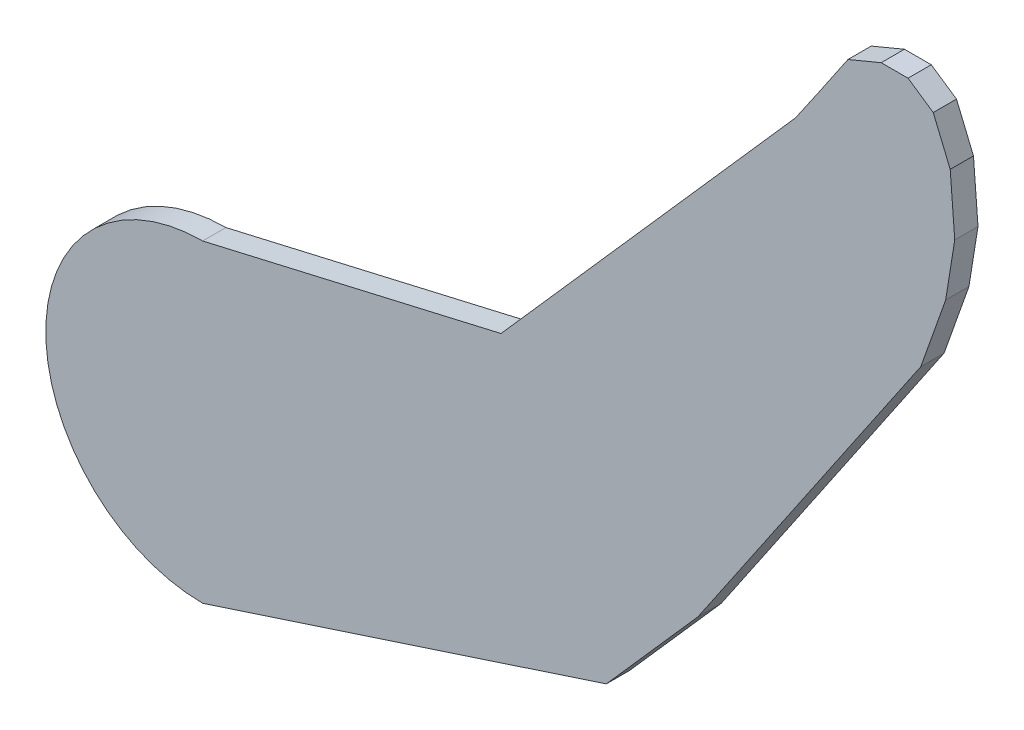
ISO-10303-21;
HEADER;
FILE_DESCRIPTION(('STEP AP214'),'2;1');
FILE_NAME('part.step','',(''),(''),'','','');
FILE_SCHEMA(('AUTOMOTIVE_DESIGN { 1 0 10303 214 1 1 1 1 }'));
ENDSEC;
DATA;
#1=APPLICATION_CONTEXT('core data for automotive mechanical design processes');
#2=APPLICATION_PROTOCOL_DEFINITION('international standard','automotive_design',2000,#1);
#3=PRODUCT_CONTEXT('',#1,'mechanical');
#4=PRODUCT('Part','Part','',(#3));
#5=PRODUCT_RELATED_PRODUCT_CATEGORY('part','',(#4));
#6=PRODUCT_DEFINITION_FORMATION('','',#4);
#7=PRODUCT_DEFINITION_CONTEXT('part definition',#1,'design');
#8=PRODUCT_DEFINITION('design','',#6,#7);
#9=PRODUCT_DEFINITION_SHAPE('','',#8);
#10=(LENGTH_UNIT() NAMED_UNIT(*) SI_UNIT(.MILLI.,.METRE.));
#11=(NAMED_UNIT(*) PLANE_ANGLE_UNIT() SI_UNIT($,.RADIAN.));
#12=(NAMED_UNIT(*) SI_UNIT($,.STERADIAN.) SOLID_ANGLE_UNIT());
#13=UNCERTAINTY_MEASURE_WITH_UNIT(LENGTH_MEASURE(1.E-05),#10,'distance_accuracy_value','');
#14=(GEOMETRIC_REPRESENTATION_CONTEXT(3) GLOBAL_UNCERTAINTY_ASSIGNED_CONTEXT((#13)) GLOBAL_UNIT_ASSIGNED_CONTEXT((#10,
#11,#12)) REPRESENTATION_CONTEXT('',''));
#15=CARTESIAN_POINT('',(0.,0.,0.));
#16=DIRECTION('',(0.,0.,1.));
#17=DIRECTION('',(1.,0.,0.));
#18=AXIS2_PLACEMENT_3D('',#15,#16,#17);
#19=CARTESIAN_POINT('',(-27.9736623903052,120.901896215262,20.));
#20=DIRECTION('',(0.225419700936087,-0.974261750470522,0.));
#21=DIRECTION('',(0.974261750470522,0.225419700936087,0.));
#22=AXIS2_PLACEMENT_3D('',#19,#20,#21);
#23=PLANE('',#22);
#24=DIRECTION('',(-0.974261750470522,-0.225419700936087,0.));
#25=VECTOR('',#24,1.);
#26=CARTESIAN_POINT('',(-27.9736623903052,120.901896215262,0.));
#27=LINE('',#26,#25);
#28=CARTESIAN_POINT('',(762.554169483522,303.810182778487,0.));
#29=VERTEX_POINT('',#28);
#30=CARTESIAN_POINT('',(506.078323886515,244.468113376824,0.));
#31=VERTEX_POINT('',#30);
#32=EDGE_CURVE('E182',#29,#31,#27,.T.);
#33=ORIENTED_EDGE('',*,*,#32,.T.);
#34=DIRECTION('',(0.,0.,-1.));
#35=VECTOR('',#34,1.);
#36=CARTESIAN_POINT('',(506.078323886515,244.468113376824,20.));
#37=LINE('',#36,#35);
#38=CARTESIAN_POINT('',(506.078323886515,244.468113376824,20.));
#39=VERTEX_POINT('',#38);
#40=EDGE_CURVE('E11',#39,#31,#37,.T.);
#41=ORIENTED_EDGE('',*,*,#40,.F.);
#42=DIRECTION('',(-0.974261750470522,-0.225419700936087,0.));
#43=VECTOR('',#42,1.);
#44=CARTESIAN_POINT('',(-27.9736623903052,120.901896215262,20.));
#45=LINE('',#44,#43);
#46=CARTESIAN_POINT('',(762.554169483522,303.810182778487,20.));
#47=VERTEX_POINT('',#46);
#48=EDGE_CURVE('E213',#47,#39,#45,.T.);
#49=ORIENTED_EDGE('',*,*,#48,.F.);
#50=DIRECTION('',(0.,0.,-1.));
#51=VECTOR('',#50,1.);
#52=CARTESIAN_POINT('',(762.554169483522,303.810182778487,20.));
#53=LINE('',#52,#51);
#54=EDGE_CURVE('E178',#47,#29,#53,.T.);
#55=ORIENTED_EDGE('',*,*,#54,.T.);
#56=EDGE_LOOP('',(#33,#41,#49,#55));
#57=FACE_BOUND('',#56,.T.);
#58=ADVANCED_FACE('F45',(#57),#23,.F.);
#59=CARTESIAN_POINT('',(506.07832388652,109.612625576141,20.));
#60=DIRECTION('',(0.,0.,-1.));
#61=DIRECTION('',(-1.,0.,0.));
#62=AXIS2_PLACEMENT_3D('',#59,#60,#61);
#63=CYLINDRICAL_SURFACE('',#62,134.85548780068);
#64=CARTESIAN_POINT('',(506.07832388652,109.612625576141,0.));
#65=DIRECTION('',(0.,0.,1.));
#66=DIRECTION('',(1.,0.,0.));
#67=AXIS2_PLACEMENT_3D('',#64,#65,#66);
#68=CIRCLE('',#67,134.85548780068);
#69=CARTESIAN_POINT('',(506.078323886515,-25.2428622245363,0.));
#70=VERTEX_POINT('',#69);
#71=EDGE_CURVE('E185',#31,#70,#68,.T.);
#72=ORIENTED_EDGE('',*,*,#71,.T.);
#73=DIRECTION('',(0.,0.,-1.));
#74=VECTOR('',#73,1.);
#75=CARTESIAN_POINT('',(506.078323886515,-25.2428622245363,20.));
#76=LINE('',#75,#74);
#77=CARTESIAN_POINT('',(506.078323886515,-25.2428622245363,20.));
#78=VERTEX_POINT('',#77);
#79=EDGE_CURVE('E53',#78,#70,#76,.T.);
#80=ORIENTED_EDGE('',*,*,#79,.F.);
#81=CARTESIAN_POINT('',(506.07832388652,109.612625576141,20.));
#82=DIRECTION('',(0.,0.,1.));
#83=DIRECTION('',(1.,0.,0.));
#84=AXIS2_PLACEMENT_3D('',#81,#82,#83);
#85=CIRCLE('',#84,134.85548780068);
#86=EDGE_CURVE('E121',#39,#78,#85,.T.);
#87=ORIENTED_EDGE('',*,*,#86,.F.);
#88=ORIENTED_EDGE('',*,*,#40,.T.);
#89=EDGE_LOOP('',(#72,#80,#87,#88));
#90=FACE_BOUND('',#89,.T.);
#91=ADVANCED_FACE('F248',(#90),#63,.T.);
#92=CARTESIAN_POINT('',(56.2990000385816,-172.25045946861,20.));
#93=DIRECTION('',(0.310670803985646,-0.950517570353601,0.));
#94=DIRECTION('',(0.950517570353601,0.310670803985646,0.));
#95=AXIS2_PLACEMENT_3D('',#92,#93,#94);
#96=PLANE('',#95);
#97=DIRECTION('',(-0.950517570353601,-0.310670803985646,0.));
#98=VECTOR('',#97,1.);
#99=CARTESIAN_POINT('',(56.2990000385816,-172.25045946861,0.));
#100=LINE('',#99,#98);
#101=CARTESIAN_POINT('',(853.07011629034,88.1692644786177,0.));
#102=VERTEX_POINT('',#101);
#103=EDGE_CURVE('E188',#102,#70,#100,.T.);
#104=ORIENTED_EDGE('',*,*,#103,.F.);
#105=DIRECTION('',(0.,0.,-1.));
#106=VECTOR('',#105,1.);
#107=CARTESIAN_POINT('',(853.07011629034,88.1692644786177,20.));
#108=LINE('',#107,#106);
#109=CARTESIAN_POINT('',(853.07011629034,88.1692644786177,20.));
#110=VERTEX_POINT('',#109);
#111=EDGE_CURVE('E241',#110,#102,#108,.T.);
#112=ORIENTED_EDGE('',*,*,#111,.F.);
#113=DIRECTION('',(-0.950517570353601,-0.310670803985646,0.));
#114=VECTOR('',#113,1.);
#115=CARTESIAN_POINT('',(56.2990000385816,-172.25045946861,20.));
#116=LINE('',#115,#114);
#117=EDGE_CURVE('E247',#110,#78,#116,.T.);
#118=ORIENTED_EDGE('',*,*,#117,.T.);
#119=ORIENTED_EDGE('',*,*,#79,.T.);
#120=EDGE_LOOP('',(#104,#112,#118,#119));
#121=FACE_BOUND('',#120,.T.);
#122=ADVANCED_FACE('F245',(#121),#96,.T.);
#123=CARTESIAN_POINT('',(436.202479970037,-384.613573474033,20.));
#124=DIRECTION('',(-0.750068966901177,0.661359618431456,0.));
#125=DIRECTION('',(-0.661359618431456,-0.750068966901177,0.));
#126=AXIS2_PLACEMENT_3D('',#123,#124,#125);
#127=PLANE('',#126);
#128=DIRECTION('',(0.661359618431456,0.750068966901177,0.));
#129=VECTOR('',#128,1.);
#130=CARTESIAN_POINT('',(436.202479970037,-384.613573474033,0.));
#131=LINE('',#130,#129);
#132=CARTESIAN_POINT('',(931.851074637414,177.517253669462,0.));
#133=VERTEX_POINT('',#132);
#134=EDGE_CURVE('E191',#102,#133,#131,.T.);
#135=ORIENTED_EDGE('',*,*,#134,.T.);
#136=DIRECTION('',(0.,0.,-1.));
#137=VECTOR('',#136,1.);
#138=CARTESIAN_POINT('',(931.851074637414,177.517253669462,20.));
#139=LINE('',#138,#137);
#140=CARTESIAN_POINT('',(931.851074637414,177.517253669462,20.));
#141=VERTEX_POINT('',#140);
#142=EDGE_CURVE('E238',#141,#133,#139,.T.);
#143=ORIENTED_EDGE('',*,*,#142,.F.);
#144=DIRECTION('',(0.661359618431456,0.750068966901177,0.));
#145=VECTOR('',#144,1.);
#146=CARTESIAN_POINT('',(436.202479970037,-384.613573474033,20.));
#147=LINE('',#146,#145);
#148=EDGE_CURVE('E267',#110,#141,#147,.T.);
#149=ORIENTED_EDGE('',*,*,#148,.F.);
#150=ORIENTED_EDGE('',*,*,#111,.T.);
#151=EDGE_LOOP('',(#135,#143,#149,#150));
#152=FACE_BOUND('',#151,.T.);
#153=ADVANCED_FACE('F258',(#152),#127,.F.);
#154=CARTESIAN_POINT('',(555.155457153364,-377.076882298712,20.));
#155=DIRECTION('',(-0.827223508552381,0.561872998904814,0.));
#156=DIRECTION('',(-0.561872998904814,-0.827223508552381,0.));
#157=AXIS2_PLACEMENT_3D('',#154,#155,#156);
#158=PLANE('',#157);
#159=DIRECTION('',(0.561872998904814,0.827223508552381,0.));
#160=VECTOR('',#159,1.);
#161=CARTESIAN_POINT('',(555.155457153364,-377.076882298712,0.));
#162=LINE('',#161,#160);
#163=CARTESIAN_POINT('',(1123.4323073276,459.574764508514,0.));
#164=VERTEX_POINT('',#163);
#165=EDGE_CURVE('E193',#133,#164,#162,.T.);
#166=ORIENTED_EDGE('',*,*,#165,.T.);
#167=DIRECTION('',(0.,0.,-1.));
#168=VECTOR('',#167,1.);
#169=CARTESIAN_POINT('',(1123.4323073276,459.574764508514,20.));
#170=LINE('',#169,#168);
#171=CARTESIAN_POINT('',(1123.4323073276,459.574764508514,20.));
#172=VERTEX_POINT('',#171);
#173=EDGE_CURVE('E235',#172,#164,#170,.T.);
#174=ORIENTED_EDGE('',*,*,#173,.F.);
#175=DIRECTION('',(0.561872998904814,0.827223508552381,0.));
#176=VECTOR('',#175,1.);
#177=CARTESIAN_POINT('',(555.155457153364,-377.076882298712,20.));
#178=LINE('',#177,#176);
#179=EDGE_CURVE('E264',#141,#172,#178,.T.);
#180=ORIENTED_EDGE('',*,*,#179,.F.);
#181=ORIENTED_EDGE('',*,*,#142,.T.);
#182=EDGE_LOOP('',(#166,#174,#180,#181));
#183=FACE_BOUND('',#182,.T.);
#184=ADVANCED_FACE('F262',(#183),#158,.F.);
#185=CARTESIAN_POINT('',(852.960677119872,-302.663466075392,20.));
#186=DIRECTION('',(-0.942427745481038,0.334409845171353,0.));
#187=DIRECTION('',(-0.334409845171353,-0.942427745481038,0.));
#188=AXIS2_PLACEMENT_3D('',#185,#186,#187);
#189=PLANE('',#188);
#190=DIRECTION('',(0.334409845171353,0.942427745481038,0.));
#191=VECTOR('',#190,1.);
#192=CARTESIAN_POINT('',(852.960677119872,-302.663466075392,0.));
#193=LINE('',#192,#191);
#194=CARTESIAN_POINT('',(1144.83410558076,519.888923221853,0.));
#195=VERTEX_POINT('',#194);
#196=EDGE_CURVE('E195',#164,#195,#193,.T.);
#197=ORIENTED_EDGE('',*,*,#196,.T.);
#198=DIRECTION('',(0.,0.,-1.));
#199=VECTOR('',#198,1.);
#200=CARTESIAN_POINT('',(1144.83410558076,519.888923221853,20.));
#201=LINE('',#200,#199);
#202=CARTESIAN_POINT('',(1144.83410558076,519.888923221853,20.));
#203=VERTEX_POINT('',#202);
#204=EDGE_CURVE('E232',#203,#195,#201,.T.);
#205=ORIENTED_EDGE('',*,*,#204,.F.);
#206=DIRECTION('',(0.334409845171353,0.942427745481038,0.));
#207=VECTOR('',#206,1.);
#208=CARTESIAN_POINT('',(852.960677119872,-302.663466075392,20.));
#209=LINE('',#208,#207);
#210=EDGE_CURVE('E266',#172,#203,#209,.T.);
#211=ORIENTED_EDGE('',*,*,#210,.F.);
#212=ORIENTED_EDGE('',*,*,#173,.T.);
#213=EDGE_LOOP('',(#197,#205,#211,#212));
#214=FACE_BOUND('',#213,.T.);
#215=ADVANCED_FACE('F317',(#214),#189,.F.);
#216=CARTESIAN_POINT('',(1035.15198699759,-165.62431792027,20.));
#217=DIRECTION('',(-0.987440631916608,0.157990501107283,0.));
#218=DIRECTION('',(-0.157990501107283,-0.987440631916608,0.));
#219=AXIS2_PLACEMENT_3D('',#216,#217,#218);
#220=PLANE('',#219);
#221=DIRECTION('',(0.157990501107283,0.987440631916608,0.));
#222=VECTOR('',#221,1.);
#223=CARTESIAN_POINT('',(1035.15198699759,-165.62431792027,0.));
#224=LINE('',#223,#222);
#225=CARTESIAN_POINT('',(1152.61657767284,568.529373797133,0.));
#226=VERTEX_POINT('',#225);
#227=EDGE_CURVE('E197',#195,#226,#224,.T.);
#228=ORIENTED_EDGE('',*,*,#227,.T.);
#229=DIRECTION('',(0.,0.,-1.));
#230=VECTOR('',#229,1.);
#231=CARTESIAN_POINT('',(1152.61657767284,568.529373797133,20.));
#232=LINE('',#231,#230);
#233=CARTESIAN_POINT('',(1152.61657767284,568.529373797133,20.));
#234=VERTEX_POINT('',#233);
#235=EDGE_CURVE('E229',#234,#226,#232,.T.);
#236=ORIENTED_EDGE('',*,*,#235,.F.);
#237=DIRECTION('',(0.157990501107283,0.987440631916608,0.));
#238=VECTOR('',#237,1.);
#239=CARTESIAN_POINT('',(1035.15198699759,-165.62431792027,20.));
#240=LINE('',#239,#238);
#241=EDGE_CURVE('E269',#203,#234,#240,.T.);
#242=ORIENTED_EDGE('',*,*,#241,.F.);
#243=ORIENTED_EDGE('',*,*,#204,.T.);
#244=EDGE_LOOP('',(#228,#236,#242,#243));
#245=FACE_BOUND('',#244,.T.);
#246=ADVANCED_FACE('F320',(#245),#220,.F.);
#247=CARTESIAN_POINT('',(1189.31225580014,91.4855581375762,20.));
#248=DIRECTION('',(-0.997054485501639,-0.0766964988839904,0.));
#249=DIRECTION('',(0.0766964988839904,-0.997054485501639,0.));
#250=AXIS2_PLACEMENT_3D('',#247,#248,#249);
#251=PLANE('',#250);
#252=DIRECTION('',(-0.0766964988839904,0.997054485501639,0.));
#253=VECTOR('',#252,1.);
#254=CARTESIAN_POINT('',(1189.31225580014,91.4855581375762,0.));
#255=LINE('',#254,#253);
#256=CARTESIAN_POINT('',(1148.72534162685,619.115442395432,0.));
#257=VERTEX_POINT('',#256);
#258=EDGE_CURVE('E199',#226,#257,#255,.T.);
#259=ORIENTED_EDGE('',*,*,#258,.T.);
#260=DIRECTION('',(0.,0.,-1.));
#261=VECTOR('',#260,1.);
#262=CARTESIAN_POINT('',(1148.72534162685,619.115442395432,20.));
#263=LINE('',#262,#261);
#264=CARTESIAN_POINT('',(1148.72534162685,619.115442395432,20.));
#265=VERTEX_POINT('',#264);
#266=EDGE_CURVE('E226',#265,#257,#263,.T.);
#267=ORIENTED_EDGE('',*,*,#266,.F.);
#268=DIRECTION('',(-0.0766964988839904,0.997054485501639,0.));
#269=VECTOR('',#268,1.);
#270=CARTESIAN_POINT('',(1189.31225580014,91.4855581375762,20.));
#271=LINE('',#270,#269);
#272=EDGE_CURVE('E275',#234,#265,#271,.T.);
#273=ORIENTED_EDGE('',*,*,#272,.F.);
#274=ORIENTED_EDGE('',*,*,#235,.T.);
#275=EDGE_LOOP('',(#259,#267,#273,#274));
#276=FACE_BOUND('',#275,.T.);
#277=ADVANCED_FACE('F324',(#276),#251,.F.);
#278=CARTESIAN_POINT('',(1198.59985643768,499.416606849591,20.));
#279=DIRECTION('',(-0.92307692307677,-0.384615384615752,0.));
#280=DIRECTION('',(0.384615384615752,-0.92307692307677,0.));
#281=AXIS2_PLACEMENT_3D('',#278,#279,#280);
#282=PLANE('',#281);
#283=DIRECTION('',(-0.384615384615752,0.92307692307677,0.));
#284=VECTOR('',#283,1.);
#285=CARTESIAN_POINT('',(1198.59985643768,499.416606849591,0.));
#286=LINE('',#285,#284);
#287=CARTESIAN_POINT('',(1134.13320645425,654.13656680963,0.));
#288=VERTEX_POINT('',#287);
#289=EDGE_CURVE('E201',#257,#288,#286,.T.);
#290=ORIENTED_EDGE('',*,*,#289,.T.);
#291=DIRECTION('',(0.,0.,-1.));
#292=VECTOR('',#291,1.);
#293=CARTESIAN_POINT('',(1134.13320645425,654.13656680963,20.));
#294=LINE('',#293,#292);
#295=CARTESIAN_POINT('',(1134.13320645425,654.13656680963,20.));
#296=VERTEX_POINT('',#295);
#297=EDGE_CURVE('E223',#296,#288,#294,.T.);
#298=ORIENTED_EDGE('',*,*,#297,.F.);
#299=DIRECTION('',(-0.384615384615752,0.92307692307677,0.));
#300=VECTOR('',#299,1.);
#301=CARTESIAN_POINT('',(1198.59985643768,499.416606849591,20.));
#302=LINE('',#301,#300);
#303=EDGE_CURVE('E277',#265,#296,#302,.T.);
#304=ORIENTED_EDGE('',*,*,#303,.F.);
#305=ORIENTED_EDGE('',*,*,#266,.T.);
#306=EDGE_LOOP('',(#290,#298,#304,#305));
#307=FACE_BOUND('',#306,.T.);
#308=ADVANCED_FACE('F328',(#307),#282,.F.);
#309=CARTESIAN_POINT('',(662.086403617073,974.763761263646,20.));
#310=DIRECTION('',(-0.561872998904815,-0.82722350855238,0.));
#311=DIRECTION('',(0.82722350855238,-0.561872998904815,0.));
#312=AXIS2_PLACEMENT_3D('',#309,#310,#311);
#313=PLANE('',#312);
#314=DIRECTION('',(-0.82722350855238,0.561872998904815,0.));
#315=VECTOR('',#314,1.);
#316=CARTESIAN_POINT('',(662.086403617073,974.763761263646,0.));
#317=LINE('',#316,#315);
#318=CARTESIAN_POINT('',(1112.46701738498,668.852839378448,0.));
#319=VERTEX_POINT('',#318);
#320=EDGE_CURVE('E203',#288,#319,#317,.T.);
#321=ORIENTED_EDGE('',*,*,#320,.T.);
#322=DIRECTION('',(0.,0.,-1.));
#323=VECTOR('',#322,1.);
#324=CARTESIAN_POINT('',(1112.46701738498,668.852839378448,20.));
#325=LINE('',#324,#323);
#326=CARTESIAN_POINT('',(1112.46701738498,668.852839378448,20.));
#327=VERTEX_POINT('',#326);
#328=EDGE_CURVE('E220',#327,#319,#325,.T.);
#329=ORIENTED_EDGE('',*,*,#328,.F.);
#330=DIRECTION('',(-0.82722350855238,0.561872998904815,0.));
#331=VECTOR('',#330,1.);
#332=CARTESIAN_POINT('',(662.086403617073,974.763761263646,20.));
#333=LINE('',#332,#331);
#334=EDGE_CURVE('E279',#296,#327,#333,.T.);
#335=ORIENTED_EDGE('',*,*,#334,.F.);
#336=ORIENTED_EDGE('',*,*,#297,.T.);
#337=EDGE_LOOP('',(#321,#329,#335,#336));
#338=FACE_BOUND('',#337,.T.);
#339=ADVANCED_FACE('F332',(#338),#313,.F.);
#340=CARTESIAN_POINT('',(0.,668.852839378448,20.));
#341=DIRECTION('',(0.,-1.,0.));
#342=DIRECTION('',(0.,0.,-1.));
#343=AXIS2_PLACEMENT_3D('',#340,#341,#342);
#344=PLANE('',#343);
#345=DIRECTION('',(-1.,0.,0.));
#346=VECTOR('',#345,1.);
#347=CARTESIAN_POINT('',(0.,668.852839378448,0.));
#348=LINE('',#347,#346);
#349=CARTESIAN_POINT('',(1089.38399192499,668.852839378448,0.));
#350=VERTEX_POINT('',#349);
#351=EDGE_CURVE('E205',#319,#350,#348,.T.);
#352=ORIENTED_EDGE('',*,*,#351,.T.);
#353=DIRECTION('',(0.,0.,-1.));
#354=VECTOR('',#353,1.);
#355=CARTESIAN_POINT('',(1089.38399192499,668.852839378448,20.));
#356=LINE('',#355,#354);
#357=CARTESIAN_POINT('',(1089.38399192499,668.852839378448,20.));
#358=VERTEX_POINT('',#357);
#359=EDGE_CURVE('E217',#358,#350,#356,.T.);
#360=ORIENTED_EDGE('',*,*,#359,.F.);
#361=DIRECTION('',(-1.,0.,0.));
#362=VECTOR('',#361,1.);
#363=CARTESIAN_POINT('',(0.,668.852839378448,20.));
#364=LINE('',#363,#362);
#365=EDGE_CURVE('E281',#327,#358,#364,.T.);
#366=ORIENTED_EDGE('',*,*,#365,.F.);
#367=ORIENTED_EDGE('',*,*,#328,.T.);
#368=EDGE_LOOP('',(#352,#360,#366,#367));
#369=FACE_BOUND('',#368,.T.);
#370=ADVANCED_FACE('F287',(#369),#344,.F.);
#371=CARTESIAN_POINT('',(-76.3110684293617,183.146564230267,20.));
#372=DIRECTION('',(0.384615384615744,-0.923076923076773,0.));
#373=DIRECTION('',(0.923076923076773,0.384615384615744,0.));
#374=AXIS2_PLACEMENT_3D('',#371,#372,#373);
#375=PLANE('',#374);
#376=DIRECTION('',(-0.923076923076773,-0.384615384615744,0.));
#377=VECTOR('',#376,1.);
#378=CARTESIAN_POINT('',(-76.3110684293617,183.146564230267,0.));
#379=LINE('',#378,#377);
#380=CARTESIAN_POINT('',(1060.81186349425,656.947785865625,0.));
#381=VERTEX_POINT('',#380);
#382=EDGE_CURVE('E207',#350,#381,#379,.T.);
#383=ORIENTED_EDGE('',*,*,#382,.T.);
#384=DIRECTION('',(0.,0.,-1.));
#385=VECTOR('',#384,1.);
#386=CARTESIAN_POINT('',(1060.81186349425,656.947785865625,20.));
#387=LINE('',#386,#385);
#388=CARTESIAN_POINT('',(1060.81186349425,656.947785865625,20.));
#389=VERTEX_POINT('',#388);
#390=EDGE_CURVE('E174',#389,#381,#387,.T.);
#391=ORIENTED_EDGE('',*,*,#390,.F.);
#392=DIRECTION('',(-0.923076923076773,-0.384615384615744,0.));
#393=VECTOR('',#392,1.);
#394=CARTESIAN_POINT('',(-76.3110684293617,183.146564230267,20.));
#395=LINE('',#394,#393);
#396=EDGE_CURVE('E161',#358,#389,#395,.T.);
#397=ORIENTED_EDGE('',*,*,#396,.F.);
#398=ORIENTED_EDGE('',*,*,#359,.T.);
#399=EDGE_LOOP('',(#383,#391,#397,#398));
#400=FACE_BOUND('',#399,.T.);
#401=ADVANCED_FACE('F291',(#400),#375,.F.);
#402=CARTESIAN_POINT('',(420.566461434368,-285.660328172302,20.));
#403=DIRECTION('',(0.827223508552378,-0.561872998904818,0.));
#404=DIRECTION('',(0.561872998904818,0.827223508552378,0.));
#405=AXIS2_PLACEMENT_3D('',#402,#403,#404);
#406=PLANE('',#405);
#407=DIRECTION('',(-0.561872998904818,-0.827223508552378,0.));
#408=VECTOR('',#407,1.);
#409=CARTESIAN_POINT('',(420.566461434368,-285.660328172302,0.));
#410=LINE('',#409,#408);
#411=CARTESIAN_POINT('',(1035.11509344185,619.115442395408,0.));
#412=VERTEX_POINT('',#411);
#413=EDGE_CURVE('E170',#381,#412,#410,.T.);
#414=ORIENTED_EDGE('',*,*,#413,.T.);
#415=DIRECTION('',(0.,0.,-1.));
#416=VECTOR('',#415,1.);
#417=CARTESIAN_POINT('',(1035.11509344185,619.115442395408,20.));
#418=LINE('',#417,#416);
#419=CARTESIAN_POINT('',(1035.11509344185,619.115442395408,20.));
#420=VERTEX_POINT('',#419);
#421=EDGE_CURVE('E167',#420,#412,#418,.T.);
#422=ORIENTED_EDGE('',*,*,#421,.F.);
#423=DIRECTION('',(-0.561872998904818,-0.827223508552378,0.));
#424=VECTOR('',#423,1.);
#425=CARTESIAN_POINT('',(420.566461434368,-285.660328172302,20.));
#426=LINE('',#425,#424);
#427=EDGE_CURVE('E155',#389,#420,#426,.T.);
#428=ORIENTED_EDGE('',*,*,#427,.F.);
#429=ORIENTED_EDGE('',*,*,#390,.T.);
#430=EDGE_LOOP('',(#414,#422,#428,#429));
#431=FACE_BOUND('',#430,.T.);
#432=ADVANCED_FACE('F168',(#431),#406,.F.);
#433=CARTESIAN_POINT('',(413.592664591776,-284.481924116286,20.));
#434=DIRECTION('',(-0.823914524539985,0.566714086865724,0.));
#435=DIRECTION('',(-0.566714086865724,-0.823914524539985,0.));
#436=AXIS2_PLACEMENT_3D('',#433,#434,#435);
#437=PLANE('',#436);
#438=DIRECTION('',(0.566714086865724,0.823914524539985,0.));
#439=VECTOR('',#438,1.);
#440=CARTESIAN_POINT('',(413.592664591776,-284.481924116286,0.));
#441=LINE('',#440,#439);
#442=CARTESIAN_POINT('',(1015.76885313443,590.989004824954,0.));
#443=VERTEX_POINT('',#442);
#444=EDGE_CURVE('E210',#443,#412,#441,.T.);
#445=ORIENTED_EDGE('',*,*,#444,.F.);
#446=DIRECTION('',(0.,0.,-1.));
#447=VECTOR('',#446,1.);
#448=CARTESIAN_POINT('',(1015.76885313443,590.989004824954,20.));
#449=LINE('',#448,#447);
#450=CARTESIAN_POINT('',(1015.76885313443,590.989004824954,20.));
#451=VERTEX_POINT('',#450);
#452=EDGE_CURVE('E110',#451,#443,#449,.T.);
#453=ORIENTED_EDGE('',*,*,#452,.F.);
#454=DIRECTION('',(0.566714086865724,0.823914524539985,0.));
#455=VECTOR('',#454,1.);
#456=CARTESIAN_POINT('',(413.592664591776,-284.481924116286,20.));
#457=LINE('',#456,#455);
#458=EDGE_CURVE('E159',#451,#420,#457,.T.);
#459=ORIENTED_EDGE('',*,*,#458,.T.);
#460=ORIENTED_EDGE('',*,*,#421,.T.);
#461=EDGE_LOOP('',(#445,#453,#459,#460));
#462=FACE_BOUND('',#461,.T.);
#463=ADVANCED_FACE('F176',(#462),#437,.T.);
#464=CARTESIAN_POINT('',(278.305913173315,-245.391158234349,20.));
#465=DIRECTION('',(0.750068966901177,-0.661359618431456,0.));
#466=DIRECTION('',(0.661359618431456,0.750068966901177,0.));
#467=AXIS2_PLACEMENT_3D('',#464,#465,#466);
#468=PLANE('',#467);
#469=DIRECTION('',(-0.661359618431456,-0.750068966901177,0.));
#470=VECTOR('',#469,1.);
#471=CARTESIAN_POINT('',(278.305913173315,-245.391158234349,0.));
#472=LINE('',#471,#470);
#473=EDGE_CURVE('E113',#443,#29,#472,.T.);
#474=ORIENTED_EDGE('',*,*,#473,.T.);
#475=ORIENTED_EDGE('',*,*,#54,.F.);
#476=DIRECTION('',(-0.661359618431456,-0.750068966901177,0.));
#477=VECTOR('',#476,1.);
#478=CARTESIAN_POINT('',(278.305913173315,-245.391158234349,20.));
#479=LINE('',#478,#477);
#480=EDGE_CURVE('E61',#451,#47,#479,.T.);
#481=ORIENTED_EDGE('',*,*,#480,.F.);
#482=ORIENTED_EDGE('',*,*,#452,.T.);
#483=EDGE_LOOP('',(#474,#475,#481,#482));
#484=FACE_BOUND('',#483,.T.);
#485=ADVANCED_FACE('F294',(#484),#468,.F.);
#486=CARTESIAN_POINT('',(0.,0.,20.));
#487=DIRECTION('',(0.,0.,1.));
#488=DIRECTION('',(1.,0.,0.));
#489=AXIS2_PLACEMENT_3D('',#486,#487,#488);
#490=PLANE('',#489);
#491=ORIENTED_EDGE('',*,*,#48,.T.);
#492=ORIENTED_EDGE('',*,*,#86,.T.);
#493=ORIENTED_EDGE('',*,*,#117,.F.);
#494=ORIENTED_EDGE('',*,*,#148,.T.);
#495=ORIENTED_EDGE('',*,*,#179,.T.);
#496=ORIENTED_EDGE('',*,*,#210,.T.);
#497=ORIENTED_EDGE('',*,*,#241,.T.);
#498=ORIENTED_EDGE('',*,*,#272,.T.);
#499=ORIENTED_EDGE('',*,*,#303,.T.);
#500=ORIENTED_EDGE('',*,*,#334,.T.);
#501=ORIENTED_EDGE('',*,*,#365,.T.);
#502=ORIENTED_EDGE('',*,*,#396,.T.);
#503=ORIENTED_EDGE('',*,*,#427,.T.);
#504=ORIENTED_EDGE('',*,*,#458,.F.);
#505=ORIENTED_EDGE('',*,*,#480,.T.);
#506=EDGE_LOOP('',(#491,#492,#493,#494,#495,#496,#497,#498,#499,#500,#501,#502,#503,#504,#505));
#507=FACE_BOUND('',#506,.T.);
#508=ADVANCED_FACE('F157',(#507),#490,.T.);
#509=CARTESIAN_POINT('',(0.,0.,0.));
#510=DIRECTION('',(0.,0.,1.));
#511=DIRECTION('',(1.,0.,0.));
#512=AXIS2_PLACEMENT_3D('',#509,#510,#511);
#513=PLANE('',#512);
#514=ORIENTED_EDGE('',*,*,#32,.F.);
#515=ORIENTED_EDGE('',*,*,#473,.F.);
#516=ORIENTED_EDGE('',*,*,#444,.T.);
#517=ORIENTED_EDGE('',*,*,#413,.F.);
#518=ORIENTED_EDGE('',*,*,#382,.F.);
#519=ORIENTED_EDGE('',*,*,#351,.F.);
#520=ORIENTED_EDGE('',*,*,#320,.F.);
#521=ORIENTED_EDGE('',*,*,#289,.F.);
#522=ORIENTED_EDGE('',*,*,#258,.F.);
#523=ORIENTED_EDGE('',*,*,#227,.F.);
#524=ORIENTED_EDGE('',*,*,#196,.F.);
#525=ORIENTED_EDGE('',*,*,#165,.F.);
#526=ORIENTED_EDGE('',*,*,#134,.F.);
#527=ORIENTED_EDGE('',*,*,#103,.T.);
#528=ORIENTED_EDGE('',*,*,#71,.F.);
#529=EDGE_LOOP('',(#514,#515,#516,#517,#518,#519,#520,#521,#522,#523,#524,#525,#526,#527,#528));
#530=FACE_BOUND('',#529,.T.);
#531=ADVANCED_FACE('F253',(#530),#513,.F.);
#532=CLOSED_SHELL('',(#58,#91,#122,#153,#184,#215,#246,#277,#308,#339,#370,#401,#432,#463,#485,
#508,#531));
#533=MANIFOLD_SOLID_BREP('B2',#532);
#534=ADVANCED_BREP_SHAPE_REPRESENTATION('',(#18,#533),#14);
#535=SHAPE_DEFINITION_REPRESENTATION(#9,#534);
ENDSEC;
END-ISO-10303-21;
